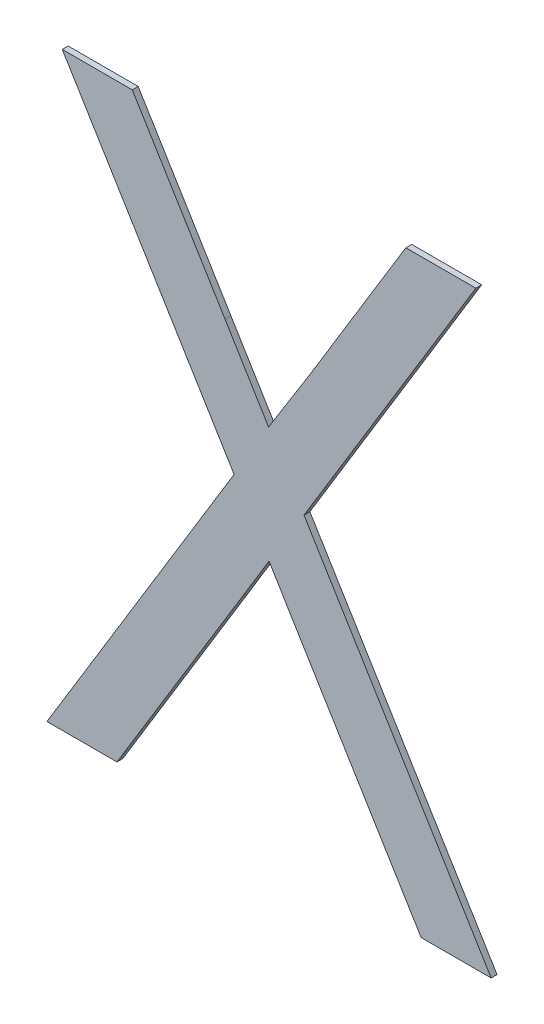
ISO-10303-21;
HEADER;
FILE_DESCRIPTION(('STEP AP214'),'2;1');
FILE_NAME('part.step','',(''),(''),'','','');
FILE_SCHEMA(('AUTOMOTIVE_DESIGN { 1 0 10303 214 1 1 1 1 }'));
ENDSEC;
DATA;
#1=APPLICATION_CONTEXT('core data for automotive mechanical design processes');
#2=APPLICATION_PROTOCOL_DEFINITION('international standard','automotive_design',2000,#1);
#3=PRODUCT_CONTEXT('',#1,'mechanical');
#4=PRODUCT('Part','Part','',(#3));
#5=PRODUCT_RELATED_PRODUCT_CATEGORY('part','',(#4));
#6=PRODUCT_DEFINITION_FORMATION('','',#4);
#7=PRODUCT_DEFINITION_CONTEXT('part definition',#1,'design');
#8=PRODUCT_DEFINITION('design','',#6,#7);
#9=PRODUCT_DEFINITION_SHAPE('','',#8);
#10=(LENGTH_UNIT() NAMED_UNIT(*) SI_UNIT(.MILLI.,.METRE.));
#11=(NAMED_UNIT(*) PLANE_ANGLE_UNIT() SI_UNIT($,.RADIAN.));
#12=(NAMED_UNIT(*) SI_UNIT($,.STERADIAN.) SOLID_ANGLE_UNIT());
#13=UNCERTAINTY_MEASURE_WITH_UNIT(LENGTH_MEASURE(1.E-05),#10,'distance_accuracy_value','');
#14=(GEOMETRIC_REPRESENTATION_CONTEXT(3) GLOBAL_UNCERTAINTY_ASSIGNED_CONTEXT((#13)) GLOBAL_UNIT_ASSIGNED_CONTEXT((#10,
#11,#12)) REPRESENTATION_CONTEXT('',''));
#15=CARTESIAN_POINT('',(0.,0.,0.));
#16=DIRECTION('',(0.,0.,1.));
#17=DIRECTION('',(1.,0.,0.));
#18=AXIS2_PLACEMENT_3D('',#15,#16,#17);
#19=CARTESIAN_POINT('',(56.8951606360528,26.8510582734634,2.92549564475551));
#20=DIRECTION('',(0.,0.,-1.));
#21=DIRECTION('',(-1.,0.,0.));
#22=AXIS2_PLACEMENT_3D('',#19,#20,#21);
#23=PLANE('',#22);
#24=DIRECTION('',(0.520104379505486,0.854102707184103,0.));
#25=VECTOR('',#24,1.);
#26=CARTESIAN_POINT('',(56.8877351646503,26.5192293588519,2.92549564475551));
#27=LINE('',#26,#25);
#28=CARTESIAN_POINT('',(56.8877351646503,26.5192293588519,2.92549564475551));
#29=VERTEX_POINT('',#28);
#30=CARTESIAN_POINT('',(56.675072826988,26.170000462748,2.92549564475551));
#31=VERTEX_POINT('',#30);
#32=EDGE_CURVE('E130',#29,#31,#27,.F.);
#33=ORIENTED_EDGE('',*,*,#32,.F.);
#34=CARTESIAN_POINT('',(56.9329984697633,26.5939237068572,2.92549564475551));
#35=CARTESIAN_POINT('',(56.9294888338161,26.5882553131887,2.92549564475551));
#36=CARTESIAN_POINT('',(56.926012391117,26.5825668840924,2.92549564475551));
#37=CARTESIAN_POINT('',(56.9196497779853,26.5720659811649,2.92549564475551));
#38=CARTESIAN_POINT('',(56.9167572664631,26.5672573589123,2.92549564475551));
#39=CARTESIAN_POINT('',(56.9109894032696,26.5576294889259,2.92549564475551));
#40=CARTESIAN_POINT('',(56.9081140517347,26.5528102411081,2.92549564475551));
#41=CARTESIAN_POINT('',(56.9022396878165,26.5432471119384,2.92549564475551));
#42=CARTESIAN_POINT('',(56.8992406710083,26.5385032332918,2.92549564475551));
#43=CARTESIAN_POINT('',(56.8948586443289,26.5313164546207,2.92549564475551));
#44=CARTESIAN_POINT('',(56.893417447493,26.5289091449932,2.92549564475551));
#45=CARTESIAN_POINT('',(56.8905604512812,26.5240788011716,2.92549564475551));
#46=CARTESIAN_POINT('',(56.8891446571911,26.5216557638444,2.92549564475551));
#47=CARTESIAN_POINT('',(56.8877351646503,26.5192293588519,2.92549564475551));
#48=B_SPLINE_CURVE_WITH_KNOTS('',3,(#34,#35,#36,#37,#38,#39,#40,#41,#42,#43,#44,#45,#46,#47),
.UNSPECIFIED.,.F.,.F.,(4,2,2,2,2,2,4),(0.,0.0200000214789173,0.0368346974631935,
0.0536695070696181,0.0705049195460328,0.0789218674575869,0.0873405469003123),.UNSPECIFIED.);
#49=CARTESIAN_POINT('',(56.9330083060454,26.5939176666501,2.92549564475551));
#50=VERTEX_POINT('',#49);
#51=EDGE_CURVE('E312',#50,#29,#48,.T.);
#52=ORIENTED_EDGE('',*,*,#51,.F.);
#53=DIRECTION('',(0.516609887083849,-0.856220897062909,0.));
#54=VECTOR('',#53,1.);
#55=CARTESIAN_POINT('',(56.9513948798771,26.5634927023852,2.92549564475551));
#56=LINE('',#55,#54);
#57=CARTESIAN_POINT('',(56.9697378088496,26.5330414093325,2.92549564475551));
#58=VERTEX_POINT('',#57);
#59=EDGE_CURVE('E381',#58,#50,#56,.F.);
#60=ORIENTED_EDGE('',*,*,#59,.F.);
#61=DIRECTION('',(0.52031034343803,-0.853977251752878,0.));
#62=VECTOR('',#61,1.);
#63=CARTESIAN_POINT('',(57.1909007490659,26.170000462748,2.92549564475551));
#64=LINE('',#63,#62);
#65=CARTESIAN_POINT('',(57.1909007490659,26.170000462748,2.92549564475551));
#66=VERTEX_POINT('',#65);
#67=EDGE_CURVE('E173',#66,#58,#64,.F.);
#68=ORIENTED_EDGE('',*,*,#67,.F.);
#69=DIRECTION('',(1.,0.,0.));
#70=VECTOR('',#69,1.);
#71=CARTESIAN_POINT('',(57.3096101646503,26.170000462748,2.92549564475551));
#72=LINE('',#71,#70);
#73=CARTESIAN_POINT('',(57.3096101646503,26.170000462748,2.92549564475551));
#74=VERTEX_POINT('',#73);
#75=EDGE_CURVE('E184',#74,#66,#72,.F.);
#76=ORIENTED_EDGE('',*,*,#75,.F.);
#77=DIRECTION('',(-0.520157948453763,0.854070084161934,0.));
#78=VECTOR('',#77,1.);
#79=CARTESIAN_POINT('',(56.9922400347802,26.6911043588519,2.92549564475551));
#80=LINE('',#79,#78);
#81=CARTESIAN_POINT('',(56.9922400347802,26.6911043588519,2.92549564475551));
#82=VERTEX_POINT('',#81);
#83=EDGE_CURVE('E190',#82,#74,#80,.F.);
#84=ORIENTED_EDGE('',*,*,#83,.F.);
#85=DIRECTION('',(0.519809136535766,0.85428242494736,0.));
#86=VECTOR('',#85,1.);
#87=CARTESIAN_POINT('',(57.2836361386763,27.170000462748,2.92549564475551));
#88=LINE('',#87,#86);
#89=CARTESIAN_POINT('',(57.2836361386763,27.170000462748,2.92549564475551));
#90=VERTEX_POINT('',#89);
#91=EDGE_CURVE('E196',#90,#82,#88,.F.);
#92=ORIENTED_EDGE('',*,*,#91,.F.);
#93=DIRECTION('',(-1.,0.,0.));
#94=VECTOR('',#93,1.);
#95=CARTESIAN_POINT('',(57.1649267230918,27.170000462748,2.92549564475551));
#96=LINE('',#95,#94);
#97=CARTESIAN_POINT('',(57.1649267230918,27.170000462748,2.92549564475551));
#98=VERTEX_POINT('',#97);
#99=EDGE_CURVE('E202',#98,#90,#96,.F.);
#100=ORIENTED_EDGE('',*,*,#99,.F.);
#101=DIRECTION('',(-0.519657694418402,-0.854374555234266,0.));
#102=VECTOR('',#101,1.);
#103=CARTESIAN_POINT('',(57.00299490491,26.9037666965142,2.92549564475551));
#104=LINE('',#103,#102);
#105=CARTESIAN_POINT('',(57.0029844338364,26.9037730293077,2.92549564475551));
#106=VERTEX_POINT('',#105);
#107=EDGE_CURVE('E208',#106,#98,#104,.F.);
#108=ORIENTED_EDGE('',*,*,#107,.F.);
#109=CARTESIAN_POINT('',(57.0029739627627,26.9037793621011,2.92549564475551));
#110=DIRECTION('',(-0.529726472160579,-0.848168535547215,0.));
#111=VECTOR('',#110,1.);
#112=LINE('',#109,#111);
#113=CARTESIAN_POINT('',(56.9321557505942,26.7903457288442,2.9254956447566));
#114=VERTEX_POINT('',#113);
#115=EDGE_CURVE('E414',#106,#114,#112,.T.);
#116=ORIENTED_EDGE('',*,*,#115,.T.);
#117=CARTESIAN_POINT('',(56.8583114633516,26.9118835796311,2.92549564475551));
#118=CARTESIAN_POINT('',(56.8657143712634,26.8994825206776,2.92549564475551));
#119=CARTESIAN_POINT('',(56.8796225940164,26.8761840152317,2.92549564475551));
#120=CARTESIAN_POINT('',(56.899720687616,26.8437920535937,2.92549564475551));
#121=CARTESIAN_POINT('',(56.9166151673067,26.8154791868731,2.92549564475551));
#122=CARTESIAN_POINT('',(56.927285427337,26.7982353052663,2.92549564475551));
#123=CARTESIAN_POINT('',(56.9321750997152,26.7903332549558,2.92549564475551));
#124=B_SPLINE_CURVE_WITH_KNOTS('',3,(#117,#118,#119,#120,#121,#122,#123),.UNSPECIFIED.,.F.,.F.,
(4,1,1,1,4),(0.,0.304616958260779,0.572299501801284,0.80400521578386,1.),.UNSPECIFIED.);
#125=CARTESIAN_POINT('',(56.8583114633516,26.9118835796311,2.92549564475551));
#126=VERTEX_POINT('',#125);
#127=EDGE_CURVE('E417',#126,#114,#124,.T.);
#128=ORIENTED_EDGE('',*,*,#127,.F.);
#129=DIRECTION('',(-0.520308975041088,0.853978085486796,0.));
#130=VECTOR('',#129,1.);
#131=CARTESIAN_POINT('',(56.701046852962,27.170000462748,2.92549564475551));
#132=LINE('',#131,#130);
#133=CARTESIAN_POINT('',(56.701046852962,27.170000462748,2.92549564475551));
#134=VERTEX_POINT('',#133);
#135=EDGE_CURVE('E355',#134,#126,#132,.F.);
#136=ORIENTED_EDGE('',*,*,#135,.F.);
#137=DIRECTION('',(-1.,0.,0.));
#138=VECTOR('',#137,1.);
#139=CARTESIAN_POINT('',(56.5823374373776,27.170000462748,2.92549564475551));
#140=LINE('',#139,#138);
#141=CARTESIAN_POINT('',(56.5823374373776,27.170000462748,2.92549564475551));
#142=VERTEX_POINT('',#141);
#143=EDGE_CURVE('E356',#142,#134,#140,.F.);
#144=ORIENTED_EDGE('',*,*,#143,.F.);
#145=DIRECTION('',(0.520130786672102,-0.854086626025639,0.));
#146=VECTOR('',#145,1.);
#147=CARTESIAN_POINT('',(56.8737335412737,26.6915102030077,2.92549564475551));
#148=LINE('',#147,#146);
#149=CARTESIAN_POINT('',(56.8737335412737,26.6915102030077,2.92549564475551));
#150=VERTEX_POINT('',#149);
#151=EDGE_CURVE('E109',#150,#142,#148,.F.);
#152=ORIENTED_EDGE('',*,*,#151,.F.);
#153=DIRECTION('',(-0.519862585319967,-0.854249900429869,0.));
#154=VECTOR('',#153,1.);
#155=CARTESIAN_POINT('',(56.5563634114035,26.170000462748,2.92549564475551));
#156=LINE('',#155,#154);
#157=CARTESIAN_POINT('',(56.5563634114035,26.170000462748,2.92549564475551));
#158=VERTEX_POINT('',#157);
#159=EDGE_CURVE('E107',#158,#150,#156,.F.);
#160=ORIENTED_EDGE('',*,*,#159,.F.);
#161=DIRECTION('',(1.,0.,0.));
#162=VECTOR('',#161,1.);
#163=CARTESIAN_POINT('',(56.6750728269879,26.170000462748,2.92549564475551));
#164=LINE('',#163,#162);
#165=EDGE_CURVE('E93',#31,#158,#164,.F.);
#166=ORIENTED_EDGE('',*,*,#165,.F.);
#167=EDGE_LOOP('',(#33,#52,#60,#68,#76,#84,#92,#100,#108,#116,#128,#136,#144,#152,#160,#166));
#168=FACE_BOUND('',#167,.T.);
#169=ADVANCED_FACE('F17',(#168),#23,.F.);
#170=CARTESIAN_POINT('',(56.6750728269879,26.170000462748,2.92549564475551));
#171=DIRECTION('',(0.,-1.,0.));
#172=DIRECTION('',(1.,0.,0.));
#173=AXIS2_PLACEMENT_3D('',#170,#171,#172);
#174=PLANE('',#173);
#175=ORIENTED_EDGE('',*,*,#165,.T.);
#176=DIRECTION('',(0.,0.,1.));
#177=VECTOR('',#176,1.);
#178=CARTESIAN_POINT('',(56.5563634114035,26.170000462748,2.92549564475551));
#179=LINE('',#178,#177);
#180=CARTESIAN_POINT('',(56.5563634114035,26.170000462748,2.91549564475552));
#181=VERTEX_POINT('',#180);
#182=EDGE_CURVE('E98',#181,#158,#179,.T.);
#183=ORIENTED_EDGE('',*,*,#182,.F.);
#184=DIRECTION('',(-1.,0.,0.));
#185=VECTOR('',#184,1.);
#186=CARTESIAN_POINT('',(56.8951606360528,26.170000462748,2.91549564475552));
#187=LINE('',#186,#185);
#188=CARTESIAN_POINT('',(56.6750728269879,26.170000462748,2.91549564475552));
#189=VERTEX_POINT('',#188);
#190=EDGE_CURVE('E125',#189,#181,#187,.T.);
#191=ORIENTED_EDGE('',*,*,#190,.F.);
#192=DIRECTION('',(0.,0.,1.));
#193=VECTOR('',#192,1.);
#194=CARTESIAN_POINT('',(56.675072826988,26.170000462748,2.92549564475551));
#195=LINE('',#194,#193);
#196=EDGE_CURVE('E101',#31,#189,#195,.F.);
#197=ORIENTED_EDGE('',*,*,#196,.F.);
#198=EDGE_LOOP('',(#175,#183,#191,#197));
#199=FACE_BOUND('',#198,.T.);
#200=ADVANCED_FACE('F95',(#199),#174,.T.);
#201=CARTESIAN_POINT('',(56.5563634114035,26.170000462748,2.92549564475551));
#202=DIRECTION('',(-0.854249900429869,0.519862585319967,0.));
#203=DIRECTION('',(-0.519862585319967,-0.854249900429869,0.));
#204=AXIS2_PLACEMENT_3D('',#201,#202,#203);
#205=PLANE('',#204);
#206=ORIENTED_EDGE('',*,*,#159,.T.);
#207=DIRECTION('',(0.,0.,1.));
#208=VECTOR('',#207,1.);
#209=CARTESIAN_POINT('',(56.8737335412737,26.6915102030077,2.92549564475551));
#210=LINE('',#209,#208);
#211=CARTESIAN_POINT('',(56.8737335412737,26.6915102030077,2.91549564475552));
#212=VERTEX_POINT('',#211);
#213=EDGE_CURVE('E112',#212,#150,#210,.T.);
#214=ORIENTED_EDGE('',*,*,#213,.F.);
#215=DIRECTION('',(0.519862585320076,0.854249900429802,0.));
#216=VECTOR('',#215,1.);
#217=CARTESIAN_POINT('',(56.5563634114035,26.170000462748,2.91549564475552));
#218=LINE('',#217,#216);
#219=EDGE_CURVE('E116',#181,#212,#218,.T.);
#220=ORIENTED_EDGE('',*,*,#219,.F.);
#221=ORIENTED_EDGE('',*,*,#182,.T.);
#222=EDGE_LOOP('',(#206,#214,#220,#221));
#223=FACE_BOUND('',#222,.T.);
#224=ADVANCED_FACE('F114',(#223),#205,.T.);
#225=CARTESIAN_POINT('',(56.8737335412737,26.6915102030077,2.92549564475551));
#226=DIRECTION('',(-0.854086626025639,-0.520130786672102,0.));
#227=DIRECTION('',(0.520130786672102,-0.854086626025639,0.));
#228=AXIS2_PLACEMENT_3D('',#225,#226,#227);
#229=PLANE('',#228);
#230=ORIENTED_EDGE('',*,*,#151,.T.);
#231=DIRECTION('',(0.,0.,1.));
#232=VECTOR('',#231,1.);
#233=CARTESIAN_POINT('',(56.5823374373776,27.170000462748,2.92549564475551));
#234=LINE('',#233,#232);
#235=CARTESIAN_POINT('',(56.5823374373776,27.170000462748,2.91549564475552));
#236=VERTEX_POINT('',#235);
#237=EDGE_CURVE('E361',#236,#142,#234,.T.);
#238=ORIENTED_EDGE('',*,*,#237,.F.);
#239=DIRECTION('',(-0.520130786672065,0.854086626025662,0.));
#240=VECTOR('',#239,1.);
#241=CARTESIAN_POINT('',(56.8737335412737,26.6915102030077,2.91549564475552));
#242=LINE('',#241,#240);
#243=EDGE_CURVE('E346',#212,#236,#242,.T.);
#244=ORIENTED_EDGE('',*,*,#243,.F.);
#245=ORIENTED_EDGE('',*,*,#213,.T.);
#246=EDGE_LOOP('',(#230,#238,#244,#245));
#247=FACE_BOUND('',#246,.T.);
#248=ADVANCED_FACE('F587',(#247),#229,.T.);
#249=CARTESIAN_POINT('',(56.5823374373776,27.170000462748,2.92549564475551));
#250=DIRECTION('',(0.,1.,0.));
#251=DIRECTION('',(-1.,0.,0.));
#252=AXIS2_PLACEMENT_3D('',#249,#250,#251);
#253=PLANE('',#252);
#254=ORIENTED_EDGE('',*,*,#143,.T.);
#255=DIRECTION('',(0.,0.,1.));
#256=VECTOR('',#255,1.);
#257=CARTESIAN_POINT('',(56.701046852962,27.170000462748,2.92549564475551));
#258=LINE('',#257,#256);
#259=CARTESIAN_POINT('',(56.701046852962,27.170000462748,2.91549564475552));
#260=VERTEX_POINT('',#259);
#261=EDGE_CURVE('E67',#260,#134,#258,.T.);
#262=ORIENTED_EDGE('',*,*,#261,.F.);
#263=DIRECTION('',(-1.,0.,0.));
#264=VECTOR('',#263,1.);
#265=CARTESIAN_POINT('',(56.8951606360528,27.170000462748,2.91549564475552));
#266=LINE('',#265,#264);
#267=EDGE_CURVE('E343',#236,#260,#266,.F.);
#268=ORIENTED_EDGE('',*,*,#267,.F.);
#269=ORIENTED_EDGE('',*,*,#237,.T.);
#270=EDGE_LOOP('',(#254,#262,#268,#269));
#271=FACE_BOUND('',#270,.T.);
#272=ADVANCED_FACE('F580',(#271),#253,.T.);
#273=CARTESIAN_POINT('',(56.701046852962,27.170000462748,2.92549564475551));
#274=DIRECTION('',(0.853978085486796,0.520308975041088,0.));
#275=DIRECTION('',(-0.520308975041088,0.853978085486796,0.));
#276=AXIS2_PLACEMENT_3D('',#273,#274,#275);
#277=PLANE('',#276);
#278=ORIENTED_EDGE('',*,*,#135,.T.);
#279=DIRECTION('',(0.,0.,1.));
#280=VECTOR('',#279,1.);
#281=CARTESIAN_POINT('',(56.8583114633516,26.9118835796311,2.92049564475552));
#282=LINE('',#281,#280);
#283=CARTESIAN_POINT('',(56.8583114633576,26.9118835796211,2.91549564475552));
#284=VERTEX_POINT('',#283);
#285=EDGE_CURVE('E55',#284,#126,#282,.T.);
#286=ORIENTED_EDGE('',*,*,#285,.F.);
#287=DIRECTION('',(0.52030897504103,-0.853978085486831,0.));
#288=VECTOR('',#287,1.);
#289=CARTESIAN_POINT('',(56.701046852962,27.170000462748,2.91549564475552));
#290=LINE('',#289,#288);
#291=EDGE_CURVE('E341',#260,#284,#290,.T.);
#292=ORIENTED_EDGE('',*,*,#291,.F.);
#293=ORIENTED_EDGE('',*,*,#261,.T.);
#294=EDGE_LOOP('',(#278,#286,#292,#293));
#295=FACE_BOUND('',#294,.T.);
#296=ADVANCED_FACE('F243',(#295),#277,.T.);
#297=CARTESIAN_POINT('',(56.8583114633516,26.9118835796311,2.92549564475551));
#298=CARTESIAN_POINT('',(56.8583114633516,26.9118835796311,2.91549564475552));
#299=CARTESIAN_POINT('',(56.8657143712634,26.8994825206776,2.92549564475551));
#300=CARTESIAN_POINT('',(56.8657143712634,26.8994825206776,2.91549564475552));
#301=CARTESIAN_POINT('',(56.8796225940164,26.8761840152317,2.92549564475551));
#302=CARTESIAN_POINT('',(56.8796225940164,26.8761840152317,2.91549564475552));
#303=CARTESIAN_POINT('',(56.899720687616,26.8437920535937,2.92549564475551));
#304=CARTESIAN_POINT('',(56.899720687616,26.8437920535937,2.91549564475552));
#305=CARTESIAN_POINT('',(56.9166151673067,26.8154791868731,2.92549564475551));
#306=CARTESIAN_POINT('',(56.9166151673067,26.8154791868731,2.91549564475552));
#307=CARTESIAN_POINT('',(56.927285427337,26.7982353052663,2.92549564475551));
#308=CARTESIAN_POINT('',(56.927285427337,26.7982353052663,2.91549564475552));
#309=CARTESIAN_POINT('',(56.9321750997152,26.7903332549558,2.92549564475551));
#310=CARTESIAN_POINT('',(56.9321750997152,26.7903332549558,2.91549564475552));
#311=B_SPLINE_SURFACE_WITH_KNOTS('',3,1,((#297,#298),(#299,#300),(#301,#302),(#303,#304),(#305,
#306),(#307,#308),(#309,#310)),.UNSPECIFIED.,.F.,.F.,.F.,(4,1,1,1,4),(2,2),(0.,
0.304616958260779,0.572299501801284,0.80400521578386,1.),(0.,1.),.UNSPECIFIED.);
#312=CARTESIAN_POINT('',(56.9321750997152,26.7903332549558,2.92549564475551));
#313=CARTESIAN_POINT('',(56.9321750997152,26.7903332549558,2.91549564475552));
#314=B_SPLINE_CURVE_WITH_KNOTS('',1,(#312,#313),.UNSPECIFIED.,.F.,.F.,(2,2),(0.,1.),.UNSPECIFIED.);
#315=CARTESIAN_POINT('',(56.9321557505942,26.7903457288441,2.91549564475552));
#316=VERTEX_POINT('',#315);
#317=EDGE_CURVE('E265',#114,#316,#314,.T.);
#318=CARTESIAN_POINT('',(56.8583114633635,26.9118835796112,2.91549564475552));
#319=CARTESIAN_POINT('',(56.8617298989998,26.9061601717267,2.91549564475552));
#320=CARTESIAN_POINT('',(56.8651464266618,26.9004354288111,2.91549564475552));
#321=CARTESIAN_POINT('',(56.8720017799714,26.8889991931216,2.91549564475552));
#322=CARTESIAN_POINT('',(56.8754406060176,26.8832877005871,2.91549564475552));
#323=CARTESIAN_POINT('',(56.8823665780778,26.8718940449316,2.91549564475552));
#324=CARTESIAN_POINT('',(56.8858537244923,26.8662118820543,2.91549564475552));
#325=CARTESIAN_POINT('',(56.8929307228297,26.854694340124,2.91549564475552));
#326=CARTESIAN_POINT('',(56.8965207493225,26.8488590674192,2.91549564475552));
#327=CARTESIAN_POINT('',(56.9036381211162,26.8371504497072,2.91549564475552));
#328=CARTESIAN_POINT('',(56.9071654666517,26.8312771048426,2.91549564475552));
#329=CARTESIAN_POINT('',(56.9142458440416,26.8195460135928,2.91549564475552));
#330=CARTESIAN_POINT('',(56.9177988756572,26.8136882670634,2.91549564475552));
#331=CARTESIAN_POINT('',(56.9249464500052,26.8019981185358,2.91549564475552));
#332=CARTESIAN_POINT('',(56.9285409930575,26.7961657167334,2.91549564475552));
#333=CARTESIAN_POINT('',(56.9321641608211,26.7903509329687,2.91549564475552));
#334=B_SPLINE_CURVE_WITH_KNOTS('',3,(#318,#319,#320,#321,#322,#323,#324,#325,#326,#327,#328,
#329,#330,#331,#332,#333),.UNSPECIFIED.,.F.,.F.,(4,2,2,2,2,2,2,4),(0.,0.0200000042043696,
0.0400003668784285,0.0600008954298358,0.0805542688774972,0.101107565389492,0.121660671101865,
0.142213935283846),.UNSPECIFIED.);
#335=EDGE_CURVE('E310',#284,#316,#334,.T.);
#336=ORIENTED_EDGE('',*,*,#127,.T.);
#337=ORIENTED_EDGE('',*,*,#317,.T.);
#338=ORIENTED_EDGE('',*,*,#335,.F.);
#339=ORIENTED_EDGE('',*,*,#285,.T.);
#340=EDGE_LOOP('',(#336,#337,#338,#339));
#341=FACE_BOUND('',#340,.T.);
#342=ADVANCED_FACE('F241',(#341),#311,.T.);
#343=CARTESIAN_POINT('',(53.0143360654114,29.3160648941622,2.92349564475465));
#344=DIRECTION('',(1.29899997563462E-11,2.07546626481913E-11,1.));
#345=DIRECTION('',(0.,-1.,2.07546626481913E-11));
#346=AXIS2_PLACEMENT_3D('',#343,#344,#345);
#347=CYLINDRICAL_SURFACE('',#346,4.66136822879057);
#348=ORIENTED_EDGE('',*,*,#317,.F.);
#349=ORIENTED_EDGE('',*,*,#115,.F.);
#350=CARTESIAN_POINT('',(57.00299490491,26.9037666965142,2.91549564475552));
#351=DIRECTION('',(0.,0.,1.));
#352=VECTOR('',#351,1.);
#353=LINE('',#350,#352);
#354=CARTESIAN_POINT('',(57.0029844338363,26.9037730293076,2.91549564475388));
#355=VERTEX_POINT('',#354);
#356=EDGE_CURVE('E211',#355,#106,#353,.T.);
#357=ORIENTED_EDGE('',*,*,#356,.F.);
#358=CARTESIAN_POINT('',(53.0143360654113,29.316064894162,2.91549564475552));
#359=DIRECTION('',(0.,0.,-1.));
#360=DIRECTION('',(-1.,0.,0.));
#361=AXIS2_PLACEMENT_3D('',#358,#359,#360);
#362=CIRCLE('',#361,4.66136822879057);
#363=EDGE_CURVE('E333',#316,#355,#362,.F.);
#364=ORIENTED_EDGE('',*,*,#363,.F.);
#365=EDGE_LOOP('',(#348,#349,#357,#364));
#366=FACE_BOUND('',#365,.T.);
#367=ADVANCED_FACE('F236',(#366),#347,.F.);
#368=CARTESIAN_POINT('',(57.00299490491,26.9037666965142,2.92549564475551));
#369=DIRECTION('',(-0.854374555234266,0.519657694418402,0.));
#370=DIRECTION('',(-0.519657694418402,-0.854374555234266,0.));
#371=AXIS2_PLACEMENT_3D('',#368,#369,#370);
#372=PLANE('',#371);
#373=ORIENTED_EDGE('',*,*,#107,.T.);
#374=DIRECTION('',(0.,0.,1.));
#375=VECTOR('',#374,1.);
#376=CARTESIAN_POINT('',(57.1649267230918,27.170000462748,2.92549564475551));
#377=LINE('',#376,#375);
#378=CARTESIAN_POINT('',(57.1649267230918,27.170000462748,2.91549564475552));
#379=VERTEX_POINT('',#378);
#380=EDGE_CURVE('E205',#379,#98,#377,.T.);
#381=ORIENTED_EDGE('',*,*,#380,.F.);
#382=DIRECTION('',(0.519657694418338,0.854374555234305,0.));
#383=VECTOR('',#382,1.);
#384=CARTESIAN_POINT('',(57.00299490491,26.9037666965142,2.91549564475552));
#385=LINE('',#384,#383);
#386=EDGE_CURVE('E335',#355,#379,#385,.T.);
#387=ORIENTED_EDGE('',*,*,#386,.F.);
#388=ORIENTED_EDGE('',*,*,#356,.T.);
#389=EDGE_LOOP('',(#373,#381,#387,#388));
#390=FACE_BOUND('',#389,.T.);
#391=ADVANCED_FACE('F225',(#390),#372,.T.);
#392=CARTESIAN_POINT('',(57.1649267230918,27.170000462748,2.92549564475551));
#393=DIRECTION('',(0.,1.,0.));
#394=DIRECTION('',(-1.,0.,0.));
#395=AXIS2_PLACEMENT_3D('',#392,#393,#394);
#396=PLANE('',#395);
#397=ORIENTED_EDGE('',*,*,#99,.T.);
#398=DIRECTION('',(0.,0.,1.));
#399=VECTOR('',#398,1.);
#400=CARTESIAN_POINT('',(57.2836361386763,27.170000462748,2.92549564475551));
#401=LINE('',#400,#399);
#402=CARTESIAN_POINT('',(57.2836361386763,27.170000462748,2.91549564475552));
#403=VERTEX_POINT('',#402);
#404=EDGE_CURVE('E199',#403,#90,#401,.T.);
#405=ORIENTED_EDGE('',*,*,#404,.F.);
#406=DIRECTION('',(-1.,0.,0.));
#407=VECTOR('',#406,1.);
#408=CARTESIAN_POINT('',(56.8951606360528,27.170000462748,2.91549564475552));
#409=LINE('',#408,#407);
#410=EDGE_CURVE('E339',#379,#403,#409,.F.);
#411=ORIENTED_EDGE('',*,*,#410,.F.);
#412=ORIENTED_EDGE('',*,*,#380,.T.);
#413=EDGE_LOOP('',(#397,#405,#411,#412));
#414=FACE_BOUND('',#413,.T.);
#415=ADVANCED_FACE('F235',(#414),#396,.T.);
#416=CARTESIAN_POINT('',(57.2836361386763,27.170000462748,2.92549564475551));
#417=DIRECTION('',(0.85428242494736,-0.519809136535766,0.));
#418=DIRECTION('',(0.519809136535766,0.85428242494736,0.));
#419=AXIS2_PLACEMENT_3D('',#416,#417,#418);
#420=PLANE('',#419);
#421=ORIENTED_EDGE('',*,*,#91,.T.);
#422=DIRECTION('',(0.,0.,1.));
#423=VECTOR('',#422,1.);
#424=CARTESIAN_POINT('',(56.9922400347802,26.6911043588519,2.92549564475551));
#425=LINE('',#424,#423);
#426=CARTESIAN_POINT('',(56.9922400347802,26.6911043588519,2.91549564475552));
#427=VERTEX_POINT('',#426);
#428=EDGE_CURVE('E193',#427,#82,#425,.T.);
#429=ORIENTED_EDGE('',*,*,#428,.F.);
#430=DIRECTION('',(-0.519809136535755,-0.854282424947367,0.));
#431=VECTOR('',#430,1.);
#432=CARTESIAN_POINT('',(57.2836361386763,27.170000462748,2.91549564475552));
#433=LINE('',#432,#431);
#434=EDGE_CURVE('E430',#403,#427,#433,.T.);
#435=ORIENTED_EDGE('',*,*,#434,.F.);
#436=ORIENTED_EDGE('',*,*,#404,.T.);
#437=EDGE_LOOP('',(#421,#429,#435,#436));
#438=FACE_BOUND('',#437,.T.);
#439=ADVANCED_FACE('F487',(#438),#420,.T.);
#440=CARTESIAN_POINT('',(56.9922400347802,26.6911043588519,2.92549564475551));
#441=DIRECTION('',(0.854070084161934,0.520157948453763,0.));
#442=DIRECTION('',(-0.520157948453763,0.854070084161934,0.));
#443=AXIS2_PLACEMENT_3D('',#440,#441,#442);
#444=PLANE('',#443);
#445=ORIENTED_EDGE('',*,*,#83,.T.);
#446=DIRECTION('',(0.,0.,1.));
#447=VECTOR('',#446,1.);
#448=CARTESIAN_POINT('',(57.3096101646503,26.170000462748,2.92549564475551));
#449=LINE('',#448,#447);
#450=CARTESIAN_POINT('',(57.3096101646503,26.170000462748,2.91549564475552));
#451=VERTEX_POINT('',#450);
#452=EDGE_CURVE('E187',#451,#74,#449,.T.);
#453=ORIENTED_EDGE('',*,*,#452,.F.);
#454=DIRECTION('',(0.520157948453724,-0.854070084161957,0.));
#455=VECTOR('',#454,1.);
#456=CARTESIAN_POINT('',(56.9922400347802,26.6911043588519,2.91549564475552));
#457=LINE('',#456,#455);
#458=EDGE_CURVE('E439',#427,#451,#457,.T.);
#459=ORIENTED_EDGE('',*,*,#458,.F.);
#460=ORIENTED_EDGE('',*,*,#428,.T.);
#461=EDGE_LOOP('',(#445,#453,#459,#460));
#462=FACE_BOUND('',#461,.T.);
#463=ADVANCED_FACE('F484',(#462),#444,.T.);
#464=CARTESIAN_POINT('',(57.3096101646503,26.170000462748,2.92549564475551));
#465=DIRECTION('',(0.,-1.,0.));
#466=DIRECTION('',(1.,0.,0.));
#467=AXIS2_PLACEMENT_3D('',#464,#465,#466);
#468=PLANE('',#467);
#469=ORIENTED_EDGE('',*,*,#75,.T.);
#470=DIRECTION('',(0.,0.,1.));
#471=VECTOR('',#470,1.);
#472=CARTESIAN_POINT('',(57.1909007490659,26.170000462748,2.92549564475551));
#473=LINE('',#472,#471);
#474=CARTESIAN_POINT('',(57.1909007490659,26.170000462748,2.91549564475552));
#475=VERTEX_POINT('',#474);
#476=EDGE_CURVE('E181',#475,#66,#473,.T.);
#477=ORIENTED_EDGE('',*,*,#476,.F.);
#478=DIRECTION('',(-1.,0.,0.));
#479=VECTOR('',#478,1.);
#480=CARTESIAN_POINT('',(56.8951606360528,26.170000462748,2.91549564475552));
#481=LINE('',#480,#479);
#482=EDGE_CURVE('E448',#451,#475,#481,.T.);
#483=ORIENTED_EDGE('',*,*,#482,.F.);
#484=ORIENTED_EDGE('',*,*,#452,.T.);
#485=EDGE_LOOP('',(#469,#477,#483,#484));
#486=FACE_BOUND('',#485,.T.);
#487=ADVANCED_FACE('F167',(#486),#468,.T.);
#488=CARTESIAN_POINT('',(57.1909007490659,26.170000462748,2.92549564475551));
#489=DIRECTION('',(-0.853977251752878,-0.52031034343803,0.));
#490=DIRECTION('',(0.52031034343803,-0.853977251752878,0.));
#491=AXIS2_PLACEMENT_3D('',#488,#489,#490);
#492=PLANE('',#491);
#493=ORIENTED_EDGE('',*,*,#67,.T.);
#494=CARTESIAN_POINT('',(56.9697599335684,26.5330547585144,2.91549564475552));
#495=DIRECTION('',(0.,0.,1.));
#496=VECTOR('',#495,1.);
#497=LINE('',#494,#496);
#498=CARTESIAN_POINT('',(56.9697378088513,26.5330414093297,2.91549564475552));
#499=VERTEX_POINT('',#498);
#500=EDGE_CURVE('E145',#499,#58,#497,.T.);
#501=ORIENTED_EDGE('',*,*,#500,.F.);
#502=DIRECTION('',(-0.520310343438086,0.853977251752844,0.));
#503=VECTOR('',#502,1.);
#504=CARTESIAN_POINT('',(57.1909007490659,26.170000462748,2.91549564475552));
#505=LINE('',#504,#503);
#506=EDGE_CURVE('E330',#475,#499,#505,.T.);
#507=ORIENTED_EDGE('',*,*,#506,.F.);
#508=ORIENTED_EDGE('',*,*,#476,.T.);
#509=EDGE_LOOP('',(#493,#501,#507,#508));
#510=FACE_BOUND('',#509,.T.);
#511=ADVANCED_FACE('F161',(#510),#492,.T.);
#512=CARTESIAN_POINT('',(56.9513948798771,26.5634927023852,2.92049564475551));
#513=DIRECTION('',(-0.856220897062909,-0.516609887083849,0.));
#514=DIRECTION('',(0.516609887083849,-0.856220897062909,0.));
#515=AXIS2_PLACEMENT_3D('',#512,#513,#514);
#516=PLANE('',#515);
#517=ORIENTED_EDGE('',*,*,#59,.T.);
#518=DIRECTION('',(0.,0.,-1.));
#519=VECTOR('',#518,1.);
#520=CARTESIAN_POINT('',(56.9330163978489,26.5939529021651,2.91549564475552));
#521=LINE('',#520,#519);
#522=CARTESIAN_POINT('',(56.9330083060454,26.5939176666501,2.91549564475552));
#523=VERTEX_POINT('',#522);
#524=EDGE_CURVE('E467',#523,#50,#521,.F.);
#525=ORIENTED_EDGE('',*,*,#524,.F.);
#526=DIRECTION('',(-0.516609887083849,0.856220897062909,0.));
#527=VECTOR('',#526,1.);
#528=CARTESIAN_POINT('',(56.8091872538869,26.7991853287533,2.91549564475552));
#529=LINE('',#528,#527);
#530=EDGE_CURVE('E327',#499,#523,#529,.T.);
#531=ORIENTED_EDGE('',*,*,#530,.F.);
#532=ORIENTED_EDGE('',*,*,#500,.T.);
#533=EDGE_LOOP('',(#517,#525,#531,#532));
#534=FACE_BOUND('',#533,.T.);
#535=ADVANCED_FACE('F151',(#534),#516,.T.);
#536=CARTESIAN_POINT('',(56.9334437175755,26.5946487785255,2.92549564475551));
#537=CARTESIAN_POINT('',(56.9334437175755,26.5946487785255,2.91549564475552));
#538=CARTESIAN_POINT('',(56.933291407726,26.5944007468594,2.92549564475551));
#539=CARTESIAN_POINT('',(56.933291407726,26.5944007468594,2.91549564475552));
#540=CARTESIAN_POINT('',(56.9331390978764,26.5941527151933,2.92549564475551));
#541=CARTESIAN_POINT('',(56.9331390978764,26.5941527151933,2.91549564475552));
#542=CARTESIAN_POINT('',(56.9329867880269,26.5939046835272,2.92549564475551));
#543=CARTESIAN_POINT('',(56.9329867880269,26.5939046835272,2.91549564475552));
#544=CARTESIAN_POINT('',(56.9278875611722,26.5856007574418,2.92549564475551));
#545=CARTESIAN_POINT('',(56.9278875611722,26.5856007574418,2.91549564475552));
#546=CARTESIAN_POINT('',(56.9185330123198,26.5703671770492,2.92549564475551));
#547=CARTESIAN_POINT('',(56.9185330123198,26.5703671770492,2.91549564475552));
#548=CARTESIAN_POINT('',(56.9061686003086,26.5494287153729,2.92549564475551));
#549=CARTESIAN_POINT('',(56.9061686003086,26.5494287153729,2.91549564475552));
#550=CARTESIAN_POINT('',(56.8958061804291,26.5330698197516,2.92549564475551));
#551=CARTESIAN_POINT('',(56.8958061804291,26.5330698197516,2.91549564475552));
#552=CARTESIAN_POINT('',(56.8901488202004,26.5233683800336,2.92549564475551));
#553=CARTESIAN_POINT('',(56.8901488202004,26.5233683800336,2.91549564475552));
#554=CARTESIAN_POINT('',(56.8877351646503,26.5192293588519,2.92549564475551));
#555=CARTESIAN_POINT('',(56.8877351646503,26.5192293588519,2.91549564475552));
#556=B_SPLINE_SURFACE_WITH_KNOTS('',3,1,((#536,#537),(#538,#539),(#540,#541),(#542,#543),(#544,
#545),(#546,#547),(#548,#549),(#550,#551),(#552,#553),(#554,#555)),.UNSPECIFIED.,.F.,.F.,.F.,(4,
3,1,1,1,4),(2,2),(-0.01,0.,0.334792980900177,0.614178851904785,0.83539330751454,1.),(0.,1.),.UNSPECIFIED.);
#557=DIRECTION('',(0.,0.,1.));
#558=VECTOR('',#557,1.);
#559=CARTESIAN_POINT('',(56.8877351646503,26.5192293588519,2.92549564475551));
#560=LINE('',#559,#558);
#561=CARTESIAN_POINT('',(56.8877351646506,26.5192293588525,2.91549564475552));
#562=VERTEX_POINT('',#561);
#563=EDGE_CURVE('E39',#562,#29,#560,.T.);
#564=CARTESIAN_POINT('',(56.9329984697633,26.5939237068572,2.91549564475552));
#565=CARTESIAN_POINT('',(56.9294888338161,26.5882553131887,2.91549564475552));
#566=CARTESIAN_POINT('',(56.926012391117,26.5825668840924,2.91549564475552));
#567=CARTESIAN_POINT('',(56.9196497779853,26.5720659811649,2.91549564475552));
#568=CARTESIAN_POINT('',(56.9167572664631,26.5672573589123,2.91549564475552));
#569=CARTESIAN_POINT('',(56.9109894032696,26.5576294889259,2.91549564475552));
#570=CARTESIAN_POINT('',(56.9081140517348,26.5528102411081,2.91549564475552));
#571=CARTESIAN_POINT('',(56.9022396878165,26.5432471119385,2.91549564475552));
#572=CARTESIAN_POINT('',(56.8992406710083,26.5385032332918,2.91549564475552));
#573=CARTESIAN_POINT('',(56.8948586443289,26.5313164546207,2.91549564475552));
#574=CARTESIAN_POINT('',(56.893417447493,26.5289091449932,2.91549564475552));
#575=CARTESIAN_POINT('',(56.8905604512812,26.5240788011716,2.91549564475552));
#576=CARTESIAN_POINT('',(56.8891446571911,26.5216557638444,2.91549564475552));
#577=CARTESIAN_POINT('',(56.8877351646503,26.5192293588519,2.91549564475552));
#578=B_SPLINE_CURVE_WITH_KNOTS('',3,(#564,#565,#566,#567,#568,#569,#570,#571,#572,#573,#574,
#575,#576,#577),.UNSPECIFIED.,.F.,.F.,(4,2,2,2,2,2,4),(0.,0.0200000214789305,0.0368346974632024,
0.0536695070696271,0.0705049195460498,0.0789218674576057,0.0873405469003345),.UNSPECIFIED.);
#579=EDGE_CURVE('E30',#523,#562,#578,.T.);
#580=ORIENTED_EDGE('',*,*,#51,.T.);
#581=ORIENTED_EDGE('',*,*,#563,.F.);
#582=ORIENTED_EDGE('',*,*,#579,.F.);
#583=ORIENTED_EDGE('',*,*,#524,.T.);
#584=EDGE_LOOP('',(#580,#581,#582,#583));
#585=FACE_BOUND('',#584,.T.);
#586=ADVANCED_FACE('F19',(#585),#556,.T.);
#587=CARTESIAN_POINT('',(56.8877351646503,26.5192293588519,2.92549564475551));
#588=DIRECTION('',(0.854102707184103,-0.520104379505486,0.));
#589=DIRECTION('',(0.520104379505486,0.854102707184103,0.));
#590=AXIS2_PLACEMENT_3D('',#587,#588,#589);
#591=PLANE('',#590);
#592=ORIENTED_EDGE('',*,*,#32,.T.);
#593=ORIENTED_EDGE('',*,*,#196,.T.);
#594=DIRECTION('',(-0.520104379505597,-0.854102707184035,0.));
#595=VECTOR('',#594,1.);
#596=CARTESIAN_POINT('',(56.8877351646503,26.5192293588519,2.91549564475552));
#597=LINE('',#596,#595);
#598=EDGE_CURVE('E11',#562,#189,#597,.T.);
#599=ORIENTED_EDGE('',*,*,#598,.F.);
#600=ORIENTED_EDGE('',*,*,#563,.T.);
#601=EDGE_LOOP('',(#592,#593,#599,#600));
#602=FACE_BOUND('',#601,.T.);
#603=ADVANCED_FACE('F162',(#602),#591,.T.);
#604=CARTESIAN_POINT('',(56.8951606360528,26.8510582734634,2.91549564475552));
#605=DIRECTION('',(0.,0.,-1.));
#606=DIRECTION('',(-1.,0.,0.));
#607=AXIS2_PLACEMENT_3D('',#604,#605,#606);
#608=PLANE('',#607);
#609=ORIENTED_EDGE('',*,*,#579,.T.);
#610=ORIENTED_EDGE('',*,*,#598,.T.);
#611=ORIENTED_EDGE('',*,*,#190,.T.);
#612=ORIENTED_EDGE('',*,*,#219,.T.);
#613=ORIENTED_EDGE('',*,*,#243,.T.);
#614=ORIENTED_EDGE('',*,*,#267,.T.);
#615=ORIENTED_EDGE('',*,*,#291,.T.);
#616=ORIENTED_EDGE('',*,*,#335,.T.);
#617=ORIENTED_EDGE('',*,*,#363,.T.);
#618=ORIENTED_EDGE('',*,*,#386,.T.);
#619=ORIENTED_EDGE('',*,*,#410,.T.);
#620=ORIENTED_EDGE('',*,*,#434,.T.);
#621=ORIENTED_EDGE('',*,*,#458,.T.);
#622=ORIENTED_EDGE('',*,*,#482,.T.);
#623=ORIENTED_EDGE('',*,*,#506,.T.);
#624=ORIENTED_EDGE('',*,*,#530,.T.);
#625=EDGE_LOOP('',(#609,#610,#611,#612,#613,#614,#615,#616,#617,#618,#619,#620,#621,#622,#623,#624));
#626=FACE_BOUND('',#625,.T.);
#627=ADVANCED_FACE('F314',(#626),#608,.T.);
#628=CLOSED_SHELL('',(#169,#200,#224,#248,#272,#296,#342,#367,#391,#415,#439,#463,#487,#511,
#535,#586,#603,#627));
#629=MANIFOLD_SOLID_BREP('B1',#628);
#630=ADVANCED_BREP_SHAPE_REPRESENTATION('',(#18,#629),#14);
#631=SHAPE_DEFINITION_REPRESENTATION(#9,#630);
ENDSEC;
END-ISO-10303-21;
